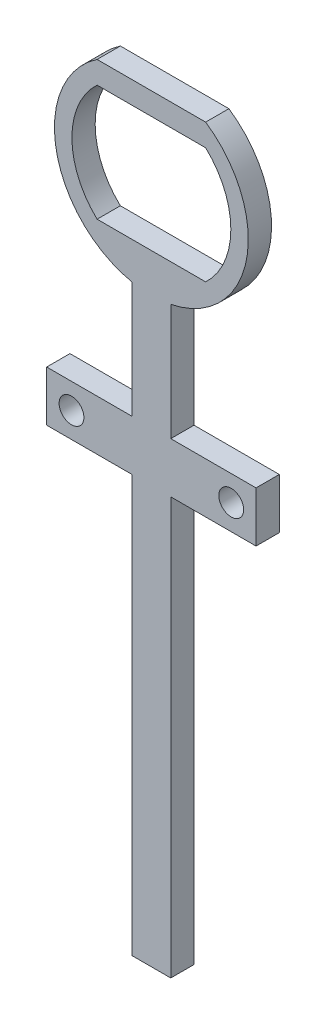
ISO-10303-21;
HEADER;
FILE_DESCRIPTION(('STEP AP214'),'2;1');
FILE_NAME('part.step','',(''),(''),'','','');
FILE_SCHEMA(('AUTOMOTIVE_DESIGN { 1 0 10303 214 1 1 1 1 }'));
ENDSEC;
DATA;
#1=APPLICATION_CONTEXT('core data for automotive mechanical design processes');
#2=APPLICATION_PROTOCOL_DEFINITION('international standard','automotive_design',2000,#1);
#3=PRODUCT_CONTEXT('',#1,'mechanical');
#4=PRODUCT('Part','Part','',(#3));
#5=PRODUCT_RELATED_PRODUCT_CATEGORY('part','',(#4));
#6=PRODUCT_DEFINITION_FORMATION('','',#4);
#7=PRODUCT_DEFINITION_CONTEXT('part definition',#1,'design');
#8=PRODUCT_DEFINITION('design','',#6,#7);
#9=PRODUCT_DEFINITION_SHAPE('','',#8);
#10=(LENGTH_UNIT() NAMED_UNIT(*) SI_UNIT(.MILLI.,.METRE.));
#11=(NAMED_UNIT(*) PLANE_ANGLE_UNIT() SI_UNIT($,.RADIAN.));
#12=(NAMED_UNIT(*) SI_UNIT($,.STERADIAN.) SOLID_ANGLE_UNIT());
#13=UNCERTAINTY_MEASURE_WITH_UNIT(LENGTH_MEASURE(1.E-05),#10,'distance_accuracy_value','');
#14=(GEOMETRIC_REPRESENTATION_CONTEXT(3) GLOBAL_UNCERTAINTY_ASSIGNED_CONTEXT((#13)) GLOBAL_UNIT_ASSIGNED_CONTEXT((#10,
#11,#12)) REPRESENTATION_CONTEXT('',''));
#15=CARTESIAN_POINT('',(0.,0.,0.));
#16=DIRECTION('',(0.,0.,1.));
#17=DIRECTION('',(1.,0.,0.));
#18=AXIS2_PLACEMENT_3D('',#15,#16,#17);
#19=CARTESIAN_POINT('',(2.5,0.,3.));
#20=DIRECTION('',(-1.,0.,0.));
#21=DIRECTION('',(0.,0.,1.));
#22=AXIS2_PLACEMENT_3D('',#19,#20,#21);
#23=PLANE('',#22);
#24=DIRECTION('',(0.,0.,-1.));
#25=VECTOR('',#24,1.);
#26=CARTESIAN_POINT('',(2.5,-33.7474487139159,3.));
#27=LINE('',#26,#25);
#28=CARTESIAN_POINT('',(2.5,-33.7474487139159,3.));
#29=VERTEX_POINT('',#28);
#30=CARTESIAN_POINT('',(2.5,-33.7474487139159,0.));
#31=VERTEX_POINT('',#30);
#32=EDGE_CURVE('E64',#29,#31,#27,.T.);
#33=ORIENTED_EDGE('',*,*,#32,.F.);
#34=DIRECTION('',(0.,1.,0.));
#35=VECTOR('',#34,1.);
#36=CARTESIAN_POINT('',(2.5,0.,3.));
#37=LINE('',#36,#35);
#38=CARTESIAN_POINT('',(2.5,-87.4874077495396,3.));
#39=VERTEX_POINT('',#38);
#40=EDGE_CURVE('E221',#39,#29,#37,.T.);
#41=ORIENTED_EDGE('',*,*,#40,.F.);
#42=DIRECTION('',(0.,0.,-1.));
#43=VECTOR('',#42,1.);
#44=CARTESIAN_POINT('',(2.5,-87.4874077495396,3.));
#45=LINE('',#44,#43);
#46=CARTESIAN_POINT('',(2.5,-87.4874077495396,0.));
#47=VERTEX_POINT('',#46);
#48=EDGE_CURVE('E265',#39,#47,#45,.T.);
#49=ORIENTED_EDGE('',*,*,#48,.T.);
#50=DIRECTION('',(0.,1.,0.));
#51=VECTOR('',#50,1.);
#52=CARTESIAN_POINT('',(2.5,0.,0.));
#53=LINE('',#52,#51);
#54=EDGE_CURVE('E249',#47,#31,#53,.T.);
#55=ORIENTED_EDGE('',*,*,#54,.T.);
#56=EDGE_LOOP('',(#33,#41,#49,#55));
#57=FACE_BOUND('',#56,.T.);
#58=ADVANCED_FACE('F39',(#57),#23,.F.);
#59=DIRECTION('',(0.,0.,1.));
#60=VECTOR('',#59,1.);
#61=CARTESIAN_POINT('',(2.5,-27.2474487139159,3.));
#62=LINE('',#61,#60);
#63=CARTESIAN_POINT('',(2.5,-27.2474487139159,0.));
#64=VERTEX_POINT('',#63);
#65=CARTESIAN_POINT('',(2.5,-27.2474487139159,3.));
#66=VERTEX_POINT('',#65);
#67=EDGE_CURVE('E196',#64,#66,#62,.T.);
#68=ORIENTED_EDGE('',*,*,#67,.F.);
#69=CARTESIAN_POINT('',(2.5,-12.2474487139159,0.));
#70=VERTEX_POINT('',#69);
#71=EDGE_CURVE('E248',#64,#70,#53,.T.);
#72=ORIENTED_EDGE('',*,*,#71,.T.);
#73=DIRECTION('',(0.,0.,-1.));
#74=VECTOR('',#73,1.);
#75=CARTESIAN_POINT('',(2.5,-12.2474487139159,3.));
#76=LINE('',#75,#74);
#77=CARTESIAN_POINT('',(2.5,-12.2474487139159,3.));
#78=VERTEX_POINT('',#77);
#79=EDGE_CURVE('E11',#78,#70,#76,.T.);
#80=ORIENTED_EDGE('',*,*,#79,.F.);
#81=EDGE_CURVE('E220',#66,#78,#37,.T.);
#82=ORIENTED_EDGE('',*,*,#81,.F.);
#83=EDGE_LOOP('',(#68,#72,#80,#82));
#84=FACE_BOUND('',#83,.T.);
#85=ADVANCED_FACE('F348',(#84),#23,.F.);
#86=CARTESIAN_POINT('',(-2.5,0.,3.));
#87=DIRECTION('',(-1.,0.,0.));
#88=DIRECTION('',(0.,0.,1.));
#89=AXIS2_PLACEMENT_3D('',#86,#87,#88);
#90=PLANE('',#89);
#91=DIRECTION('',(0.,1.,0.));
#92=VECTOR('',#91,1.);
#93=CARTESIAN_POINT('',(-2.5,0.,3.));
#94=LINE('',#93,#92);
#95=CARTESIAN_POINT('',(-2.5,-87.4874077495396,3.));
#96=VERTEX_POINT('',#95);
#97=CARTESIAN_POINT('',(-2.5,-33.7474487139159,3.));
#98=VERTEX_POINT('',#97);
#99=EDGE_CURVE('E232',#96,#98,#94,.T.);
#100=ORIENTED_EDGE('',*,*,#99,.T.);
#101=DIRECTION('',(0.,0.,-1.));
#102=VECTOR('',#101,1.);
#103=CARTESIAN_POINT('',(-2.5,-33.7474487139159,3.));
#104=LINE('',#103,#102);
#105=CARTESIAN_POINT('',(-2.5,-33.7474487139159,0.));
#106=VERTEX_POINT('',#105);
#107=EDGE_CURVE('E174',#98,#106,#104,.T.);
#108=ORIENTED_EDGE('',*,*,#107,.T.);
#109=DIRECTION('',(0.,1.,0.));
#110=VECTOR('',#109,1.);
#111=CARTESIAN_POINT('',(-2.5,0.,0.));
#112=LINE('',#111,#110);
#113=CARTESIAN_POINT('',(-2.5,-87.4874077495396,0.));
#114=VERTEX_POINT('',#113);
#115=EDGE_CURVE('E261',#114,#106,#112,.T.);
#116=ORIENTED_EDGE('',*,*,#115,.F.);
#117=DIRECTION('',(0.,0.,-1.));
#118=VECTOR('',#117,1.);
#119=CARTESIAN_POINT('',(-2.5,-87.4874077495396,3.));
#120=LINE('',#119,#118);
#121=EDGE_CURVE('E268',#96,#114,#120,.T.);
#122=ORIENTED_EDGE('',*,*,#121,.F.);
#123=EDGE_LOOP('',(#100,#108,#116,#122));
#124=FACE_BOUND('',#123,.T.);
#125=ADVANCED_FACE('F362',(#124),#90,.T.);
#126=CARTESIAN_POINT('',(-2.5,-27.2474487139159,0.));
#127=VERTEX_POINT('',#126);
#128=CARTESIAN_POINT('',(-2.5,-12.2474487139159,0.));
#129=VERTEX_POINT('',#128);
#130=EDGE_CURVE('E260',#127,#129,#112,.T.);
#131=ORIENTED_EDGE('',*,*,#130,.F.);
#132=DIRECTION('',(0.,0.,1.));
#133=VECTOR('',#132,1.);
#134=CARTESIAN_POINT('',(-2.5,-27.2474487139159,3.));
#135=LINE('',#134,#133);
#136=CARTESIAN_POINT('',(-2.5,-27.2474487139159,3.));
#137=VERTEX_POINT('',#136);
#138=EDGE_CURVE('E193',#127,#137,#135,.T.);
#139=ORIENTED_EDGE('',*,*,#138,.T.);
#140=CARTESIAN_POINT('',(-2.5,-12.2474487139159,3.));
#141=VERTEX_POINT('',#140);
#142=EDGE_CURVE('E231',#137,#141,#94,.T.);
#143=ORIENTED_EDGE('',*,*,#142,.T.);
#144=DIRECTION('',(0.,0.,-1.));
#145=VECTOR('',#144,1.);
#146=CARTESIAN_POINT('',(-2.5,-12.2474487139159,3.));
#147=LINE('',#146,#145);
#148=EDGE_CURVE('E270',#141,#129,#147,.T.);
#149=ORIENTED_EDGE('',*,*,#148,.T.);
#150=EDGE_LOOP('',(#131,#139,#143,#149));
#151=FACE_BOUND('',#150,.T.);
#152=ADVANCED_FACE('F367',(#151),#90,.T.);
#153=CARTESIAN_POINT('',(0.,0.,3.));
#154=DIRECTION('',(0.,0.,-1.));
#155=DIRECTION('',(-1.,0.,0.));
#156=AXIS2_PLACEMENT_3D('',#153,#154,#155);
#157=CYLINDRICAL_SURFACE('',#156,12.5);
#158=CARTESIAN_POINT('',(0.,0.,0.));
#159=DIRECTION('',(0.,0.,1.));
#160=DIRECTION('',(1.,0.,0.));
#161=AXIS2_PLACEMENT_3D('',#158,#159,#160);
#162=CIRCLE('',#161,12.5);
#163=CARTESIAN_POINT('',(7.,10.356157588604,0.));
#164=VERTEX_POINT('',#163);
#165=EDGE_CURVE('E251',#70,#164,#162,.T.);
#166=ORIENTED_EDGE('',*,*,#165,.T.);
#167=DIRECTION('',(0.,0.,-1.));
#168=VECTOR('',#167,1.);
#169=CARTESIAN_POINT('',(7.,10.356157588604,3.));
#170=LINE('',#169,#168);
#171=CARTESIAN_POINT('',(7.,10.356157588604,3.));
#172=VERTEX_POINT('',#171);
#173=EDGE_CURVE('E48',#172,#164,#170,.T.);
#174=ORIENTED_EDGE('',*,*,#173,.F.);
#175=CARTESIAN_POINT('',(0.,0.,3.));
#176=DIRECTION('',(0.,0.,1.));
#177=DIRECTION('',(1.,0.,0.));
#178=AXIS2_PLACEMENT_3D('',#175,#176,#177);
#179=CIRCLE('',#178,12.5);
#180=EDGE_CURVE('E223',#78,#172,#179,.T.);
#181=ORIENTED_EDGE('',*,*,#180,.F.);
#182=ORIENTED_EDGE('',*,*,#79,.T.);
#183=EDGE_LOOP('',(#166,#174,#181,#182));
#184=FACE_BOUND('',#183,.T.);
#185=ADVANCED_FACE('F378',(#184),#157,.T.);
#186=CARTESIAN_POINT('',(0.,10.356157588604,3.));
#187=DIRECTION('',(0.,1.,0.));
#188=DIRECTION('',(0.,0.,1.));
#189=AXIS2_PLACEMENT_3D('',#186,#187,#188);
#190=PLANE('',#189);
#191=DIRECTION('',(1.,0.,0.));
#192=VECTOR('',#191,1.);
#193=CARTESIAN_POINT('',(0.,10.356157588604,0.));
#194=LINE('',#193,#192);
#195=CARTESIAN_POINT('',(-7.,10.356157588604,0.));
#196=VERTEX_POINT('',#195);
#197=EDGE_CURVE('E254',#196,#164,#194,.T.);
#198=ORIENTED_EDGE('',*,*,#197,.F.);
#199=DIRECTION('',(0.,0.,-1.));
#200=VECTOR('',#199,1.);
#201=CARTESIAN_POINT('',(-7.,10.356157588604,3.));
#202=LINE('',#201,#200);
#203=CARTESIAN_POINT('',(-7.,10.356157588604,3.));
#204=VERTEX_POINT('',#203);
#205=EDGE_CURVE('E273',#204,#196,#202,.T.);
#206=ORIENTED_EDGE('',*,*,#205,.F.);
#207=DIRECTION('',(1.,0.,0.));
#208=VECTOR('',#207,1.);
#209=CARTESIAN_POINT('',(0.,10.356157588604,3.));
#210=LINE('',#209,#208);
#211=EDGE_CURVE('E225',#204,#172,#210,.T.);
#212=ORIENTED_EDGE('',*,*,#211,.T.);
#213=ORIENTED_EDGE('',*,*,#173,.T.);
#214=EDGE_LOOP('',(#198,#206,#212,#213));
#215=FACE_BOUND('',#214,.T.);
#216=ADVANCED_FACE('F374',(#215),#190,.T.);
#217=CARTESIAN_POINT('',(0.,0.,3.));
#218=DIRECTION('',(0.,0.,-1.));
#219=DIRECTION('',(-1.,0.,0.));
#220=AXIS2_PLACEMENT_3D('',#217,#218,#219);
#221=CYLINDRICAL_SURFACE('',#220,12.5);
#222=CARTESIAN_POINT('',(0.,0.,0.));
#223=DIRECTION('',(0.,0.,1.));
#224=DIRECTION('',(1.,0.,0.));
#225=AXIS2_PLACEMENT_3D('',#222,#223,#224);
#226=CIRCLE('',#225,12.5);
#227=EDGE_CURVE('E257',#196,#129,#226,.T.);
#228=ORIENTED_EDGE('',*,*,#227,.T.);
#229=ORIENTED_EDGE('',*,*,#148,.F.);
#230=CARTESIAN_POINT('',(0.,0.,3.));
#231=DIRECTION('',(0.,0.,1.));
#232=DIRECTION('',(1.,0.,0.));
#233=AXIS2_PLACEMENT_3D('',#230,#231,#232);
#234=CIRCLE('',#233,12.5);
#235=EDGE_CURVE('E228',#204,#141,#234,.T.);
#236=ORIENTED_EDGE('',*,*,#235,.F.);
#237=ORIENTED_EDGE('',*,*,#205,.T.);
#238=EDGE_LOOP('',(#228,#229,#236,#237));
#239=FACE_BOUND('',#238,.T.);
#240=ADVANCED_FACE('F371',(#239),#221,.T.);
#241=CARTESIAN_POINT('',(0.,0.,3.));
#242=DIRECTION('',(0.,0.,-1.));
#243=DIRECTION('',(-1.,0.,0.));
#244=AXIS2_PLACEMENT_3D('',#241,#242,#243);
#245=CYLINDRICAL_SURFACE('',#244,10.25);
#246=CARTESIAN_POINT('',(0.,0.,0.));
#247=DIRECTION('',(0.,0.,1.));
#248=DIRECTION('',(1.,0.,0.));
#249=AXIS2_PLACEMENT_3D('',#246,#247,#248);
#250=CIRCLE('',#249,10.25);
#251=CARTESIAN_POINT('',(7.,-7.48748956593597,0.));
#252=VERTEX_POINT('',#251);
#253=CARTESIAN_POINT('',(7.,7.48748956593597,0.));
#254=VERTEX_POINT('',#253);
#255=EDGE_CURVE('E207',#252,#254,#250,.T.);
#256=ORIENTED_EDGE('',*,*,#255,.F.);
#257=DIRECTION('',(0.,0.,-1.));
#258=VECTOR('',#257,1.);
#259=CARTESIAN_POINT('',(7.,-7.48748956593597,3.));
#260=LINE('',#259,#258);
#261=CARTESIAN_POINT('',(7.,-7.48748956593597,3.));
#262=VERTEX_POINT('',#261);
#263=EDGE_CURVE('E43',#262,#252,#260,.T.);
#264=ORIENTED_EDGE('',*,*,#263,.F.);
#265=CARTESIAN_POINT('',(0.,0.,3.));
#266=DIRECTION('',(0.,0.,1.));
#267=DIRECTION('',(1.,0.,0.));
#268=AXIS2_PLACEMENT_3D('',#265,#266,#267);
#269=CIRCLE('',#268,10.25);
#270=CARTESIAN_POINT('',(7.,7.48748956593597,3.));
#271=VERTEX_POINT('',#270);
#272=EDGE_CURVE('E208',#262,#271,#269,.T.);
#273=ORIENTED_EDGE('',*,*,#272,.T.);
#274=DIRECTION('',(0.,0.,-1.));
#275=VECTOR('',#274,1.);
#276=CARTESIAN_POINT('',(7.,7.48748956593597,3.));
#277=LINE('',#276,#275);
#278=EDGE_CURVE('E236',#271,#254,#277,.T.);
#279=ORIENTED_EDGE('',*,*,#278,.T.);
#280=EDGE_LOOP('',(#256,#264,#273,#279));
#281=FACE_BOUND('',#280,.T.);
#282=ADVANCED_FACE('F41',(#281),#245,.F.);
#283=CARTESIAN_POINT('',(0.,-7.48748956593597,3.));
#284=DIRECTION('',(0.,1.,0.));
#285=DIRECTION('',(0.,0.,1.));
#286=AXIS2_PLACEMENT_3D('',#283,#284,#285);
#287=PLANE('',#286);
#288=DIRECTION('',(1.,0.,0.));
#289=VECTOR('',#288,1.);
#290=CARTESIAN_POINT('',(0.,-7.48748956593597,0.));
#291=LINE('',#290,#289);
#292=CARTESIAN_POINT('',(-7.,-7.48748956593597,0.));
#293=VERTEX_POINT('',#292);
#294=EDGE_CURVE('E239',#293,#252,#291,.T.);
#295=ORIENTED_EDGE('',*,*,#294,.F.);
#296=DIRECTION('',(0.,0.,-1.));
#297=VECTOR('',#296,1.);
#298=CARTESIAN_POINT('',(-7.,-7.48748956593597,3.));
#299=LINE('',#298,#297);
#300=CARTESIAN_POINT('',(-7.,-7.48748956593597,3.));
#301=VERTEX_POINT('',#300);
#302=EDGE_CURVE('E278',#301,#293,#299,.T.);
#303=ORIENTED_EDGE('',*,*,#302,.F.);
#304=DIRECTION('',(1.,0.,0.));
#305=VECTOR('',#304,1.);
#306=CARTESIAN_POINT('',(0.,-7.48748956593597,3.));
#307=LINE('',#306,#305);
#308=EDGE_CURVE('E211',#301,#262,#307,.T.);
#309=ORIENTED_EDGE('',*,*,#308,.T.);
#310=ORIENTED_EDGE('',*,*,#263,.T.);
#311=EDGE_LOOP('',(#295,#303,#309,#310));
#312=FACE_BOUND('',#311,.T.);
#313=ADVANCED_FACE('F284',(#312),#287,.T.);
#314=CARTESIAN_POINT('',(0.,0.,3.));
#315=DIRECTION('',(0.,0.,-1.));
#316=DIRECTION('',(-1.,0.,0.));
#317=AXIS2_PLACEMENT_3D('',#314,#315,#316);
#318=CYLINDRICAL_SURFACE('',#317,10.25);
#319=CARTESIAN_POINT('',(0.,0.,0.));
#320=DIRECTION('',(0.,0.,1.));
#321=DIRECTION('',(1.,0.,0.));
#322=AXIS2_PLACEMENT_3D('',#319,#320,#321);
#323=CIRCLE('',#322,10.25);
#324=CARTESIAN_POINT('',(-7.,7.48748956593597,0.));
#325=VERTEX_POINT('',#324);
#326=EDGE_CURVE('E242',#325,#293,#323,.T.);
#327=ORIENTED_EDGE('',*,*,#326,.F.);
#328=DIRECTION('',(0.,0.,-1.));
#329=VECTOR('',#328,1.);
#330=CARTESIAN_POINT('',(-7.,7.48748956593597,3.));
#331=LINE('',#330,#329);
#332=CARTESIAN_POINT('',(-7.,7.48748956593597,3.));
#333=VERTEX_POINT('',#332);
#334=EDGE_CURVE('E277',#333,#325,#331,.T.);
#335=ORIENTED_EDGE('',*,*,#334,.F.);
#336=CARTESIAN_POINT('',(0.,0.,3.));
#337=DIRECTION('',(0.,0.,1.));
#338=DIRECTION('',(1.,0.,0.));
#339=AXIS2_PLACEMENT_3D('',#336,#337,#338);
#340=CIRCLE('',#339,10.25);
#341=EDGE_CURVE('E215',#333,#301,#340,.T.);
#342=ORIENTED_EDGE('',*,*,#341,.T.);
#343=ORIENTED_EDGE('',*,*,#302,.T.);
#344=EDGE_LOOP('',(#327,#335,#342,#343));
#345=FACE_BOUND('',#344,.T.);
#346=ADVANCED_FACE('F293',(#345),#318,.F.);
#347=CARTESIAN_POINT('',(0.,7.48748956593597,3.));
#348=DIRECTION('',(0.,1.,0.));
#349=DIRECTION('',(0.,0.,1.));
#350=AXIS2_PLACEMENT_3D('',#347,#348,#349);
#351=PLANE('',#350);
#352=DIRECTION('',(1.,0.,0.));
#353=VECTOR('',#352,1.);
#354=CARTESIAN_POINT('',(0.,7.48748956593597,0.));
#355=LINE('',#354,#353);
#356=EDGE_CURVE('E245',#325,#254,#355,.T.);
#357=ORIENTED_EDGE('',*,*,#356,.T.);
#358=ORIENTED_EDGE('',*,*,#278,.F.);
#359=DIRECTION('',(1.,0.,0.));
#360=VECTOR('',#359,1.);
#361=CARTESIAN_POINT('',(0.,7.48748956593597,3.));
#362=LINE('',#361,#360);
#363=EDGE_CURVE('E218',#333,#271,#362,.T.);
#364=ORIENTED_EDGE('',*,*,#363,.F.);
#365=ORIENTED_EDGE('',*,*,#334,.T.);
#366=EDGE_LOOP('',(#357,#358,#364,#365));
#367=FACE_BOUND('',#366,.T.);
#368=ADVANCED_FACE('F297',(#367),#351,.F.);
#369=CARTESIAN_POINT('',(0.,-87.4874077495396,3.));
#370=DIRECTION('',(0.,1.,0.));
#371=DIRECTION('',(0.,0.,1.));
#372=AXIS2_PLACEMENT_3D('',#369,#370,#371);
#373=PLANE('',#372);
#374=DIRECTION('',(1.,0.,0.));
#375=VECTOR('',#374,1.);
#376=CARTESIAN_POINT('',(0.,-87.4874077495396,0.));
#377=LINE('',#376,#375);
#378=EDGE_CURVE('E212',#114,#47,#377,.T.);
#379=ORIENTED_EDGE('',*,*,#378,.T.);
#380=ORIENTED_EDGE('',*,*,#48,.F.);
#381=DIRECTION('',(1.,0.,0.));
#382=VECTOR('',#381,1.);
#383=CARTESIAN_POINT('',(0.,-87.4874077495396,3.));
#384=LINE('',#383,#382);
#385=EDGE_CURVE('E234',#96,#39,#384,.T.);
#386=ORIENTED_EDGE('',*,*,#385,.F.);
#387=ORIENTED_EDGE('',*,*,#121,.T.);
#388=EDGE_LOOP('',(#379,#380,#386,#387));
#389=FACE_BOUND('',#388,.T.);
#390=ADVANCED_FACE('F300',(#389),#373,.F.);
#391=CARTESIAN_POINT('',(0.,0.,3.));
#392=DIRECTION('',(0.,0.,1.));
#393=DIRECTION('',(1.,0.,0.));
#394=AXIS2_PLACEMENT_3D('',#391,#392,#393);
#395=PLANE('',#394);
#396=ORIENTED_EDGE('',*,*,#142,.F.);
#397=DIRECTION('',(-1.,0.,0.));
#398=VECTOR('',#397,1.);
#399=CARTESIAN_POINT('',(13.5,-27.2474487139159,3.));
#400=LINE('',#399,#398);
#401=CARTESIAN_POINT('',(-13.5,-27.2474487139159,3.));
#402=VERTEX_POINT('',#401);
#403=EDGE_CURVE('E56',#137,#402,#400,.T.);
#404=ORIENTED_EDGE('',*,*,#403,.T.);
#405=DIRECTION('',(0.,-1.,0.));
#406=VECTOR('',#405,1.);
#407=CARTESIAN_POINT('',(-13.5,-27.2474487139159,3.));
#408=LINE('',#407,#406);
#409=CARTESIAN_POINT('',(-13.5,-33.7474487139159,3.));
#410=VERTEX_POINT('',#409);
#411=EDGE_CURVE('E182',#402,#410,#408,.T.);
#412=ORIENTED_EDGE('',*,*,#411,.T.);
#413=DIRECTION('',(1.,0.,0.));
#414=VECTOR('',#413,1.);
#415=CARTESIAN_POINT('',(13.5,-33.7474487139159,3.));
#416=LINE('',#415,#414);
#417=EDGE_CURVE('E167',#410,#98,#416,.T.);
#418=ORIENTED_EDGE('',*,*,#417,.T.);
#419=ORIENTED_EDGE('',*,*,#99,.F.);
#420=ORIENTED_EDGE('',*,*,#385,.T.);
#421=ORIENTED_EDGE('',*,*,#40,.T.);
#422=CARTESIAN_POINT('',(13.5,-33.7474487139159,3.));
#423=VERTEX_POINT('',#422);
#424=EDGE_CURVE('E179',#29,#423,#416,.T.);
#425=ORIENTED_EDGE('',*,*,#424,.T.);
#426=DIRECTION('',(0.,1.,0.));
#427=VECTOR('',#426,1.);
#428=CARTESIAN_POINT('',(13.5,-27.2474487139159,3.));
#429=LINE('',#428,#427);
#430=CARTESIAN_POINT('',(13.5,-27.2474487139159,3.));
#431=VERTEX_POINT('',#430);
#432=EDGE_CURVE('E178',#423,#431,#429,.T.);
#433=ORIENTED_EDGE('',*,*,#432,.T.);
#434=EDGE_CURVE('E320',#431,#66,#400,.T.);
#435=ORIENTED_EDGE('',*,*,#434,.T.);
#436=ORIENTED_EDGE('',*,*,#81,.T.);
#437=ORIENTED_EDGE('',*,*,#180,.T.);
#438=ORIENTED_EDGE('',*,*,#211,.F.);
#439=ORIENTED_EDGE('',*,*,#235,.T.);
#440=EDGE_LOOP('',(#396,#404,#412,#418,#419,#420,#421,#425,#433,#435,#436,#437,#438,#439));
#441=FACE_BOUND('',#440,.T.);
#442=ORIENTED_EDGE('',*,*,#272,.F.);
#443=ORIENTED_EDGE('',*,*,#308,.F.);
#444=ORIENTED_EDGE('',*,*,#341,.F.);
#445=ORIENTED_EDGE('',*,*,#363,.T.);
#446=EDGE_LOOP('',(#442,#443,#444,#445));
#447=FACE_BOUND('',#446,.T.);
#448=CARTESIAN_POINT('',(-10.3,-30.4974487139159,3.));
#449=DIRECTION('',(0.,0.,1.));
#450=DIRECTION('',(1.,0.,0.));
#451=AXIS2_PLACEMENT_3D('',#448,#449,#450);
#452=CIRCLE('',#451,1.6);
#453=CARTESIAN_POINT('',(-8.69999999999998,-30.4974487139159,3.));
#454=VERTEX_POINT('',#453);
#455=EDGE_CURVE('E305',#454,#454,#452,.T.);
#456=ORIENTED_EDGE('',*,*,#455,.F.);
#457=EDGE_LOOP('',(#456));
#458=FACE_BOUND('',#457,.T.);
#459=CARTESIAN_POINT('',(10.3,-30.4974487139159,3.));
#460=DIRECTION('',(0.,0.,1.));
#461=DIRECTION('',(-1.,0.,0.));
#462=AXIS2_PLACEMENT_3D('',#459,#460,#461);
#463=CIRCLE('',#462,1.6);
#464=CARTESIAN_POINT('',(8.69999999999998,-30.4974487139159,3.));
#465=VERTEX_POINT('',#464);
#466=EDGE_CURVE('E308',#465,#465,#463,.T.);
#467=ORIENTED_EDGE('',*,*,#466,.F.);
#468=EDGE_LOOP('',(#467));
#469=FACE_BOUND('',#468,.T.);
#470=ADVANCED_FACE('F184',(#441,#447,#458,#469),#395,.T.);
#471=CARTESIAN_POINT('',(0.,0.,0.));
#472=DIRECTION('',(0.,0.,1.));
#473=DIRECTION('',(1.,0.,0.));
#474=AXIS2_PLACEMENT_3D('',#471,#472,#473);
#475=PLANE('',#474);
#476=ORIENTED_EDGE('',*,*,#71,.F.);
#477=DIRECTION('',(-1.,0.,0.));
#478=VECTOR('',#477,1.);
#479=CARTESIAN_POINT('',(13.5,-27.2474487139159,0.));
#480=LINE('',#479,#478);
#481=CARTESIAN_POINT('',(13.5,-27.2474487139159,0.));
#482=VERTEX_POINT('',#481);
#483=EDGE_CURVE('E188',#482,#64,#480,.T.);
#484=ORIENTED_EDGE('',*,*,#483,.F.);
#485=DIRECTION('',(0.,1.,0.));
#486=VECTOR('',#485,1.);
#487=CARTESIAN_POINT('',(13.5,-27.2474487139159,0.));
#488=LINE('',#487,#486);
#489=CARTESIAN_POINT('',(13.5,-33.7474487139159,0.));
#490=VERTEX_POINT('',#489);
#491=EDGE_CURVE('E328',#490,#482,#488,.T.);
#492=ORIENTED_EDGE('',*,*,#491,.F.);
#493=DIRECTION('',(1.,0.,0.));
#494=VECTOR('',#493,1.);
#495=CARTESIAN_POINT('',(13.5,-33.7474487139159,0.));
#496=LINE('',#495,#494);
#497=EDGE_CURVE('E325',#31,#490,#496,.T.);
#498=ORIENTED_EDGE('',*,*,#497,.F.);
#499=ORIENTED_EDGE('',*,*,#54,.F.);
#500=ORIENTED_EDGE('',*,*,#378,.F.);
#501=ORIENTED_EDGE('',*,*,#115,.T.);
#502=CARTESIAN_POINT('',(-13.5,-33.7474487139159,0.));
#503=VERTEX_POINT('',#502);
#504=EDGE_CURVE('E326',#503,#106,#496,.T.);
#505=ORIENTED_EDGE('',*,*,#504,.F.);
#506=DIRECTION('',(0.,-1.,0.));
#507=VECTOR('',#506,1.);
#508=CARTESIAN_POINT('',(-13.5,-27.2474487139159,0.));
#509=LINE('',#508,#507);
#510=CARTESIAN_POINT('',(-13.5,-27.2474487139159,0.));
#511=VERTEX_POINT('',#510);
#512=EDGE_CURVE('E192',#511,#503,#509,.T.);
#513=ORIENTED_EDGE('',*,*,#512,.F.);
#514=EDGE_CURVE('E330',#127,#511,#480,.T.);
#515=ORIENTED_EDGE('',*,*,#514,.F.);
#516=ORIENTED_EDGE('',*,*,#130,.T.);
#517=ORIENTED_EDGE('',*,*,#227,.F.);
#518=ORIENTED_EDGE('',*,*,#197,.T.);
#519=ORIENTED_EDGE('',*,*,#165,.F.);
#520=EDGE_LOOP('',(#476,#484,#492,#498,#499,#500,#501,#505,#513,#515,#516,#517,#518,#519));
#521=FACE_BOUND('',#520,.T.);
#522=ORIENTED_EDGE('',*,*,#255,.T.);
#523=ORIENTED_EDGE('',*,*,#356,.F.);
#524=ORIENTED_EDGE('',*,*,#326,.T.);
#525=ORIENTED_EDGE('',*,*,#294,.T.);
#526=EDGE_LOOP('',(#522,#523,#524,#525));
#527=FACE_BOUND('',#526,.T.);
#528=CARTESIAN_POINT('',(-10.3,-30.4974487139159,0.));
#529=DIRECTION('',(0.,0.,1.));
#530=DIRECTION('',(1.,0.,0.));
#531=AXIS2_PLACEMENT_3D('',#528,#529,#530);
#532=CIRCLE('',#531,1.6);
#533=CARTESIAN_POINT('',(-8.69999999999998,-30.4974487139159,0.));
#534=VERTEX_POINT('',#533);
#535=EDGE_CURVE('E310',#534,#534,#532,.T.);
#536=ORIENTED_EDGE('',*,*,#535,.T.);
#537=EDGE_LOOP('',(#536));
#538=FACE_BOUND('',#537,.T.);
#539=CARTESIAN_POINT('',(10.3,-30.4974487139159,0.));
#540=DIRECTION('',(0.,0.,1.));
#541=DIRECTION('',(-1.,0.,0.));
#542=AXIS2_PLACEMENT_3D('',#539,#540,#541);
#543=CIRCLE('',#542,1.6);
#544=CARTESIAN_POINT('',(8.69999999999998,-30.4974487139159,0.));
#545=VERTEX_POINT('',#544);
#546=EDGE_CURVE('E311',#545,#545,#543,.T.);
#547=ORIENTED_EDGE('',*,*,#546,.T.);
#548=EDGE_LOOP('',(#547));
#549=FACE_BOUND('',#548,.T.);
#550=ADVANCED_FACE('F291',(#521,#527,#538,#549),#475,.F.);
#551=CARTESIAN_POINT('',(-10.3,-30.4974487139159,3.));
#552=DIRECTION('',(0.,0.,-1.));
#553=DIRECTION('',(-1.,0.,0.));
#554=AXIS2_PLACEMENT_3D('',#551,#552,#553);
#555=CYLINDRICAL_SURFACE('',#554,1.6);
#556=ORIENTED_EDGE('',*,*,#455,.T.);
#557=EDGE_LOOP('',(#556));
#558=FACE_BOUND('',#557,.T.);
#559=ORIENTED_EDGE('',*,*,#535,.F.);
#560=EDGE_LOOP('',(#559));
#561=FACE_BOUND('',#560,.T.);
#562=ADVANCED_FACE('F411',(#558,#561),#555,.F.);
#563=CARTESIAN_POINT('',(-13.5,-27.2474487139159,3.));
#564=DIRECTION('',(1.,0.,0.));
#565=DIRECTION('',(0.,0.,-1.));
#566=AXIS2_PLACEMENT_3D('',#563,#564,#565);
#567=PLANE('',#566);
#568=ORIENTED_EDGE('',*,*,#512,.T.);
#569=DIRECTION('',(0.,0.,-1.));
#570=VECTOR('',#569,1.);
#571=CARTESIAN_POINT('',(-13.5,-33.7474487139159,3.));
#572=LINE('',#571,#570);
#573=EDGE_CURVE('E171',#410,#503,#572,.T.);
#574=ORIENTED_EDGE('',*,*,#573,.F.);
#575=ORIENTED_EDGE('',*,*,#411,.F.);
#576=DIRECTION('',(0.,0.,-1.));
#577=VECTOR('',#576,1.);
#578=CARTESIAN_POINT('',(-13.5,-27.2474487139159,3.));
#579=LINE('',#578,#577);
#580=EDGE_CURVE('E323',#402,#511,#579,.T.);
#581=ORIENTED_EDGE('',*,*,#580,.T.);
#582=EDGE_LOOP('',(#568,#574,#575,#581));
#583=FACE_BOUND('',#582,.T.);
#584=ADVANCED_FACE('F190',(#583),#567,.F.);
#585=CARTESIAN_POINT('',(13.5,-33.7474487139159,3.));
#586=DIRECTION('',(0.,1.,0.));
#587=DIRECTION('',(0.,0.,1.));
#588=AXIS2_PLACEMENT_3D('',#585,#586,#587);
#589=PLANE('',#588);
#590=ORIENTED_EDGE('',*,*,#107,.F.);
#591=ORIENTED_EDGE('',*,*,#417,.F.);
#592=ORIENTED_EDGE('',*,*,#573,.T.);
#593=ORIENTED_EDGE('',*,*,#504,.T.);
#594=EDGE_LOOP('',(#590,#591,#592,#593));
#595=FACE_BOUND('',#594,.T.);
#596=ADVANCED_FACE('F169',(#595),#589,.F.);
#597=CARTESIAN_POINT('',(13.5,-27.2474487139159,3.));
#598=DIRECTION('',(0.,-1.,0.));
#599=DIRECTION('',(1.,0.,0.));
#600=AXIS2_PLACEMENT_3D('',#597,#598,#599);
#601=PLANE('',#600);
#602=ORIENTED_EDGE('',*,*,#138,.F.);
#603=ORIENTED_EDGE('',*,*,#514,.T.);
#604=ORIENTED_EDGE('',*,*,#580,.F.);
#605=ORIENTED_EDGE('',*,*,#403,.F.);
#606=EDGE_LOOP('',(#602,#603,#604,#605));
#607=FACE_BOUND('',#606,.T.);
#608=ADVANCED_FACE('F417',(#607),#601,.F.);
#609=ORIENTED_EDGE('',*,*,#424,.F.);
#610=ORIENTED_EDGE('',*,*,#32,.T.);
#611=ORIENTED_EDGE('',*,*,#497,.T.);
#612=DIRECTION('',(0.,0.,-1.));
#613=VECTOR('',#612,1.);
#614=CARTESIAN_POINT('',(13.5,-33.7474487139159,3.));
#615=LINE('',#614,#613);
#616=EDGE_CURVE('E194',#423,#490,#615,.T.);
#617=ORIENTED_EDGE('',*,*,#616,.F.);
#618=EDGE_LOOP('',(#609,#610,#611,#617));
#619=FACE_BOUND('',#618,.T.);
#620=ADVANCED_FACE('F354',(#619),#589,.F.);
#621=ORIENTED_EDGE('',*,*,#483,.T.);
#622=ORIENTED_EDGE('',*,*,#67,.T.);
#623=ORIENTED_EDGE('',*,*,#434,.F.);
#624=DIRECTION('',(0.,0.,-1.));
#625=VECTOR('',#624,1.);
#626=CARTESIAN_POINT('',(13.5,-27.2474487139159,3.));
#627=LINE('',#626,#625);
#628=EDGE_CURVE('E199',#431,#482,#627,.T.);
#629=ORIENTED_EDGE('',*,*,#628,.T.);
#630=EDGE_LOOP('',(#621,#622,#623,#629));
#631=FACE_BOUND('',#630,.T.);
#632=ADVANCED_FACE('F338',(#631),#601,.F.);
#633=CARTESIAN_POINT('',(13.5,-27.2474487139159,3.));
#634=DIRECTION('',(-1.,0.,0.));
#635=DIRECTION('',(0.,0.,1.));
#636=AXIS2_PLACEMENT_3D('',#633,#634,#635);
#637=PLANE('',#636);
#638=ORIENTED_EDGE('',*,*,#491,.T.);
#639=ORIENTED_EDGE('',*,*,#628,.F.);
#640=ORIENTED_EDGE('',*,*,#432,.F.);
#641=ORIENTED_EDGE('',*,*,#616,.T.);
#642=EDGE_LOOP('',(#638,#639,#640,#641));
#643=FACE_BOUND('',#642,.T.);
#644=ADVANCED_FACE('F352',(#643),#637,.F.);
#645=CARTESIAN_POINT('',(10.3,-30.4974487139159,3.));
#646=DIRECTION('',(0.,0.,-1.));
#647=DIRECTION('',(-1.,0.,0.));
#648=AXIS2_PLACEMENT_3D('',#645,#646,#647);
#649=CYLINDRICAL_SURFACE('',#648,1.6);
#650=ORIENTED_EDGE('',*,*,#466,.T.);
#651=EDGE_LOOP('',(#650));
#652=FACE_BOUND('',#651,.T.);
#653=ORIENTED_EDGE('',*,*,#546,.F.);
#654=EDGE_LOOP('',(#653));
#655=FACE_BOUND('',#654,.T.);
#656=ADVANCED_FACE('F420',(#652,#655),#649,.F.);
#657=CLOSED_SHELL('',(#58,#85,#125,#152,#185,#216,#240,#282,#313,#346,#368,#390,#470,#550,#562,
#584,#596,#608,#620,#632,#644,#656));
#658=MANIFOLD_SOLID_BREP('B2',#657);
#659=ADVANCED_BREP_SHAPE_REPRESENTATION('',(#18,#658),#14);
#660=SHAPE_DEFINITION_REPRESENTATION(#9,#659);
ENDSEC;
END-ISO-10303-21;
